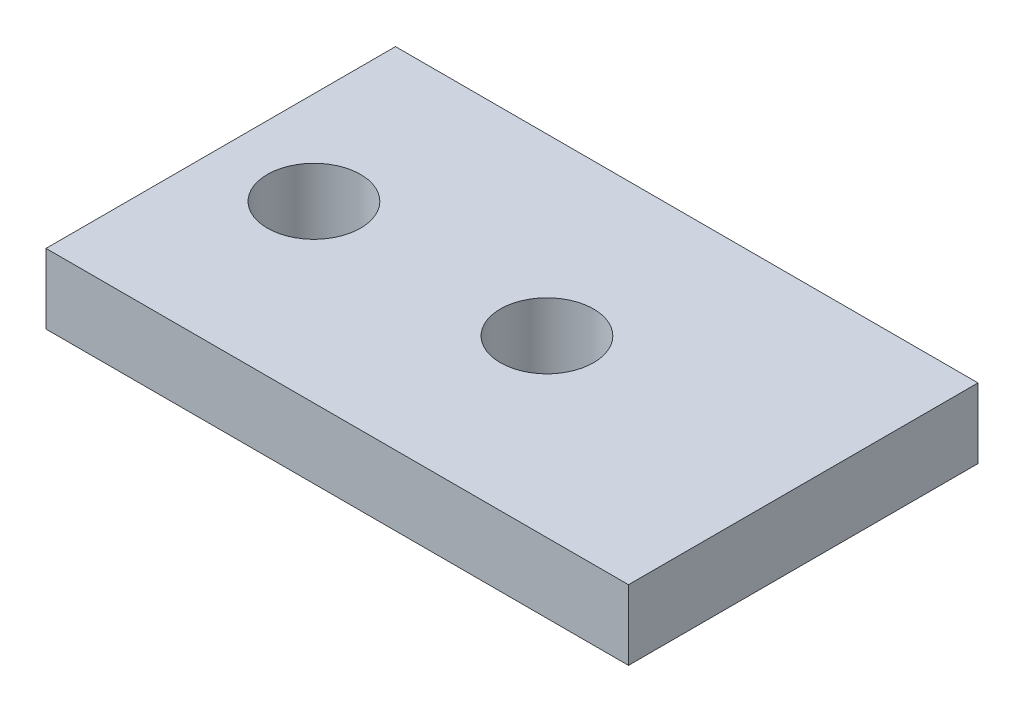
ISO-10303-21;
HEADER;
FILE_DESCRIPTION(('STEP AP214'),'2;1');
FILE_NAME('part.step','',(''),(''),'','','');
FILE_SCHEMA(('AUTOMOTIVE_DESIGN { 1 0 10303 214 1 1 1 1 }'));
ENDSEC;
DATA;
#1=APPLICATION_CONTEXT('core data for automotive mechanical design processes');
#2=APPLICATION_PROTOCOL_DEFINITION('international standard','automotive_design',2000,#1);
#3=PRODUCT_CONTEXT('',#1,'mechanical');
#4=PRODUCT('Part','Part','',(#3));
#5=PRODUCT_RELATED_PRODUCT_CATEGORY('part','',(#4));
#6=PRODUCT_DEFINITION_FORMATION('','',#4);
#7=PRODUCT_DEFINITION_CONTEXT('part definition',#1,'design');
#8=PRODUCT_DEFINITION('design','',#6,#7);
#9=PRODUCT_DEFINITION_SHAPE('','',#8);
#10=(LENGTH_UNIT() NAMED_UNIT(*) SI_UNIT(.MILLI.,.METRE.));
#11=(NAMED_UNIT(*) PLANE_ANGLE_UNIT() SI_UNIT($,.RADIAN.));
#12=(NAMED_UNIT(*) SI_UNIT($,.STERADIAN.) SOLID_ANGLE_UNIT());
#13=UNCERTAINTY_MEASURE_WITH_UNIT(LENGTH_MEASURE(1.E-05),#10,'distance_accuracy_value','');
#14=(GEOMETRIC_REPRESENTATION_CONTEXT(3) GLOBAL_UNCERTAINTY_ASSIGNED_CONTEXT((#13)) GLOBAL_UNIT_ASSIGNED_CONTEXT((#10,
#11,#12)) REPRESENTATION_CONTEXT('',''));
#15=CARTESIAN_POINT('',(0.,0.,0.));
#16=DIRECTION('',(0.,0.,1.));
#17=DIRECTION('',(1.,0.,0.));
#18=AXIS2_PLACEMENT_3D('',#15,#16,#17);
#19=CARTESIAN_POINT('',(-25.,6.,15.));
#20=DIRECTION('',(0.,1.,0.));
#21=DIRECTION('',(0.,0.,1.));
#22=AXIS2_PLACEMENT_3D('',#19,#20,#21);
#23=PLANE('',#22);
#24=CARTESIAN_POINT('',(3.,6.,0.));
#25=DIRECTION('',(0.,1.,0.));
#26=DIRECTION('',(0.,0.,1.));
#27=AXIS2_PLACEMENT_3D('',#24,#25,#26);
#28=CIRCLE('',#27,4.);
#29=CARTESIAN_POINT('',(3.,6.,4.));
#30=VERTEX_POINT('',#29);
#31=EDGE_CURVE('E99',#30,#30,#28,.T.);
#32=ORIENTED_EDGE('',*,*,#31,.F.);
#33=EDGE_LOOP('',(#32));
#34=FACE_BOUND('',#33,.T.);
#35=DIRECTION('',(0.,0.,1.));
#36=VECTOR('',#35,1.);
#37=CARTESIAN_POINT('',(-25.,6.,-15.));
#38=LINE('',#37,#36);
#39=CARTESIAN_POINT('',(-25.,6.,-15.));
#40=VERTEX_POINT('',#39);
#41=CARTESIAN_POINT('',(-25.,6.,15.));
#42=VERTEX_POINT('',#41);
#43=EDGE_CURVE('E84',#40,#42,#38,.T.);
#44=ORIENTED_EDGE('',*,*,#43,.T.);
#45=DIRECTION('',(1.,0.,0.));
#46=VECTOR('',#45,1.);
#47=CARTESIAN_POINT('',(-25.,6.,15.));
#48=LINE('',#47,#46);
#49=CARTESIAN_POINT('',(25.,6.,15.));
#50=VERTEX_POINT('',#49);
#51=EDGE_CURVE('E79',#42,#50,#48,.T.);
#52=ORIENTED_EDGE('',*,*,#51,.T.);
#53=DIRECTION('',(0.,0.,-1.));
#54=VECTOR('',#53,1.);
#55=CARTESIAN_POINT('',(25.,6.,-15.));
#56=LINE('',#55,#54);
#57=CARTESIAN_POINT('',(25.,6.,-15.));
#58=VERTEX_POINT('',#57);
#59=EDGE_CURVE('E82',#50,#58,#56,.T.);
#60=ORIENTED_EDGE('',*,*,#59,.T.);
#61=DIRECTION('',(-1.,0.,0.));
#62=VECTOR('',#61,1.);
#63=CARTESIAN_POINT('',(-25.,6.,-15.));
#64=LINE('',#63,#62);
#65=EDGE_CURVE('E49',#58,#40,#64,.T.);
#66=ORIENTED_EDGE('',*,*,#65,.T.);
#67=EDGE_LOOP('',(#44,#52,#60,#66));
#68=FACE_BOUND('',#67,.T.);
#69=CARTESIAN_POINT('',(-17.,6.,0.));
#70=DIRECTION('',(0.,1.,0.));
#71=DIRECTION('',(0.,0.,1.));
#72=AXIS2_PLACEMENT_3D('',#69,#70,#71);
#73=CIRCLE('',#72,4.);
#74=CARTESIAN_POINT('',(-17.,6.,4.));
#75=VERTEX_POINT('',#74);
#76=EDGE_CURVE('E114',#75,#75,#73,.T.);
#77=ORIENTED_EDGE('',*,*,#76,.F.);
#78=EDGE_LOOP('',(#77));
#79=FACE_BOUND('',#78,.T.);
#80=ADVANCED_FACE('F32',(#34,#68,#79),#23,.T.);
#81=CARTESIAN_POINT('',(-25.,0.,15.));
#82=DIRECTION('',(0.,1.,0.));
#83=DIRECTION('',(0.,0.,1.));
#84=AXIS2_PLACEMENT_3D('',#81,#82,#83);
#85=PLANE('',#84);
#86=CARTESIAN_POINT('',(3.,0.,0.));
#87=DIRECTION('',(0.,1.,0.));
#88=DIRECTION('',(0.,0.,1.));
#89=AXIS2_PLACEMENT_3D('',#86,#87,#88);
#90=CIRCLE('',#89,4.);
#91=CARTESIAN_POINT('',(3.,0.,4.));
#92=VERTEX_POINT('',#91);
#93=EDGE_CURVE('E111',#92,#92,#90,.T.);
#94=ORIENTED_EDGE('',*,*,#93,.T.);
#95=EDGE_LOOP('',(#94));
#96=FACE_BOUND('',#95,.T.);
#97=DIRECTION('',(0.,0.,1.));
#98=VECTOR('',#97,1.);
#99=CARTESIAN_POINT('',(-25.,0.,-15.));
#100=LINE('',#99,#98);
#101=CARTESIAN_POINT('',(-25.,0.,-15.));
#102=VERTEX_POINT('',#101);
#103=CARTESIAN_POINT('',(-25.,0.,15.));
#104=VERTEX_POINT('',#103);
#105=EDGE_CURVE('E96',#102,#104,#100,.T.);
#106=ORIENTED_EDGE('',*,*,#105,.F.);
#107=DIRECTION('',(-1.,0.,0.));
#108=VECTOR('',#107,1.);
#109=CARTESIAN_POINT('',(-25.,0.,-15.));
#110=LINE('',#109,#108);
#111=CARTESIAN_POINT('',(25.,0.,-15.));
#112=VERTEX_POINT('',#111);
#113=EDGE_CURVE('E72',#112,#102,#110,.T.);
#114=ORIENTED_EDGE('',*,*,#113,.F.);
#115=DIRECTION('',(0.,0.,-1.));
#116=VECTOR('',#115,1.);
#117=CARTESIAN_POINT('',(25.,0.,-15.));
#118=LINE('',#117,#116);
#119=CARTESIAN_POINT('',(25.,0.,15.));
#120=VERTEX_POINT('',#119);
#121=EDGE_CURVE('E66',#120,#112,#118,.T.);
#122=ORIENTED_EDGE('',*,*,#121,.F.);
#123=DIRECTION('',(1.,0.,0.));
#124=VECTOR('',#123,1.);
#125=CARTESIAN_POINT('',(-25.,0.,15.));
#126=LINE('',#125,#124);
#127=EDGE_CURVE('E88',#104,#120,#126,.T.);
#128=ORIENTED_EDGE('',*,*,#127,.F.);
#129=EDGE_LOOP('',(#106,#114,#122,#128));
#130=FACE_BOUND('',#129,.T.);
#131=CARTESIAN_POINT('',(-17.,0.,0.));
#132=DIRECTION('',(0.,1.,0.));
#133=DIRECTION('',(0.,0.,1.));
#134=AXIS2_PLACEMENT_3D('',#131,#132,#133);
#135=CIRCLE('',#134,4.);
#136=CARTESIAN_POINT('',(-17.,0.,4.));
#137=VERTEX_POINT('',#136);
#138=EDGE_CURVE('E117',#137,#137,#135,.T.);
#139=ORIENTED_EDGE('',*,*,#138,.T.);
#140=EDGE_LOOP('',(#139));
#141=FACE_BOUND('',#140,.T.);
#142=ADVANCED_FACE('F107',(#96,#130,#141),#85,.F.);
#143=CARTESIAN_POINT('',(-25.,6.,-15.));
#144=DIRECTION('',(1.,0.,0.));
#145=DIRECTION('',(0.,0.,-1.));
#146=AXIS2_PLACEMENT_3D('',#143,#144,#145);
#147=PLANE('',#146);
#148=ORIENTED_EDGE('',*,*,#105,.T.);
#149=DIRECTION('',(0.,-1.,0.));
#150=VECTOR('',#149,1.);
#151=CARTESIAN_POINT('',(-25.,6.,15.));
#152=LINE('',#151,#150);
#153=EDGE_CURVE('E11',#42,#104,#152,.T.);
#154=ORIENTED_EDGE('',*,*,#153,.F.);
#155=ORIENTED_EDGE('',*,*,#43,.F.);
#156=DIRECTION('',(0.,-1.,0.));
#157=VECTOR('',#156,1.);
#158=CARTESIAN_POINT('',(-25.,6.,-15.));
#159=LINE('',#158,#157);
#160=EDGE_CURVE('E92',#40,#102,#159,.T.);
#161=ORIENTED_EDGE('',*,*,#160,.T.);
#162=EDGE_LOOP('',(#148,#154,#155,#161));
#163=FACE_BOUND('',#162,.T.);
#164=ADVANCED_FACE('F34',(#163),#147,.F.);
#165=CARTESIAN_POINT('',(-25.,6.,15.));
#166=DIRECTION('',(0.,0.,-1.));
#167=DIRECTION('',(-1.,0.,0.));
#168=AXIS2_PLACEMENT_3D('',#165,#166,#167);
#169=PLANE('',#168);
#170=ORIENTED_EDGE('',*,*,#127,.T.);
#171=DIRECTION('',(0.,-1.,0.));
#172=VECTOR('',#171,1.);
#173=CARTESIAN_POINT('',(25.,6.,15.));
#174=LINE('',#173,#172);
#175=EDGE_CURVE('E41',#50,#120,#174,.T.);
#176=ORIENTED_EDGE('',*,*,#175,.F.);
#177=ORIENTED_EDGE('',*,*,#51,.F.);
#178=ORIENTED_EDGE('',*,*,#153,.T.);
#179=EDGE_LOOP('',(#170,#176,#177,#178));
#180=FACE_BOUND('',#179,.T.);
#181=ADVANCED_FACE('F87',(#180),#169,.F.);
#182=CARTESIAN_POINT('',(25.,6.,-15.));
#183=DIRECTION('',(-1.,0.,0.));
#184=DIRECTION('',(0.,0.,1.));
#185=AXIS2_PLACEMENT_3D('',#182,#183,#184);
#186=PLANE('',#185);
#187=ORIENTED_EDGE('',*,*,#121,.T.);
#188=DIRECTION('',(0.,-1.,0.));
#189=VECTOR('',#188,1.);
#190=CARTESIAN_POINT('',(25.,6.,-15.));
#191=LINE('',#190,#189);
#192=EDGE_CURVE('E89',#58,#112,#191,.T.);
#193=ORIENTED_EDGE('',*,*,#192,.F.);
#194=ORIENTED_EDGE('',*,*,#59,.F.);
#195=ORIENTED_EDGE('',*,*,#175,.T.);
#196=EDGE_LOOP('',(#187,#193,#194,#195));
#197=FACE_BOUND('',#196,.T.);
#198=ADVANCED_FACE('F90',(#197),#186,.F.);
#199=CARTESIAN_POINT('',(-25.,6.,-15.));
#200=DIRECTION('',(0.,0.,1.));
#201=DIRECTION('',(1.,0.,0.));
#202=AXIS2_PLACEMENT_3D('',#199,#200,#201);
#203=PLANE('',#202);
#204=ORIENTED_EDGE('',*,*,#113,.T.);
#205=ORIENTED_EDGE('',*,*,#160,.F.);
#206=ORIENTED_EDGE('',*,*,#65,.F.);
#207=ORIENTED_EDGE('',*,*,#192,.T.);
#208=EDGE_LOOP('',(#204,#205,#206,#207));
#209=FACE_BOUND('',#208,.T.);
#210=ADVANCED_FACE('F104',(#209),#203,.F.);
#211=CARTESIAN_POINT('',(3.,6.,0.));
#212=DIRECTION('',(0.,-1.,0.));
#213=DIRECTION('',(0.,0.,-1.));
#214=AXIS2_PLACEMENT_3D('',#211,#212,#213);
#215=CYLINDRICAL_SURFACE('',#214,4.);
#216=ORIENTED_EDGE('',*,*,#31,.T.);
#217=EDGE_LOOP('',(#216));
#218=FACE_BOUND('',#217,.T.);
#219=ORIENTED_EDGE('',*,*,#93,.F.);
#220=EDGE_LOOP('',(#219));
#221=FACE_BOUND('',#220,.T.);
#222=ADVANCED_FACE('F135',(#218,#221),#215,.F.);
#223=CARTESIAN_POINT('',(-17.,6.,0.));
#224=DIRECTION('',(0.,-1.,0.));
#225=DIRECTION('',(0.,0.,-1.));
#226=AXIS2_PLACEMENT_3D('',#223,#224,#225);
#227=CYLINDRICAL_SURFACE('',#226,4.);
#228=ORIENTED_EDGE('',*,*,#76,.T.);
#229=EDGE_LOOP('',(#228));
#230=FACE_BOUND('',#229,.T.);
#231=ORIENTED_EDGE('',*,*,#138,.F.);
#232=EDGE_LOOP('',(#231));
#233=FACE_BOUND('',#232,.T.);
#234=ADVANCED_FACE('F123',(#230,#233),#227,.F.);
#235=CLOSED_SHELL('',(#80,#142,#164,#181,#198,#210,#222,#234));
#236=MANIFOLD_SOLID_BREP('B2',#235);
#237=ADVANCED_BREP_SHAPE_REPRESENTATION('',(#18,#236),#14);
#238=SHAPE_DEFINITION_REPRESENTATION(#9,#237);
ENDSEC;
END-ISO-10303-21;
